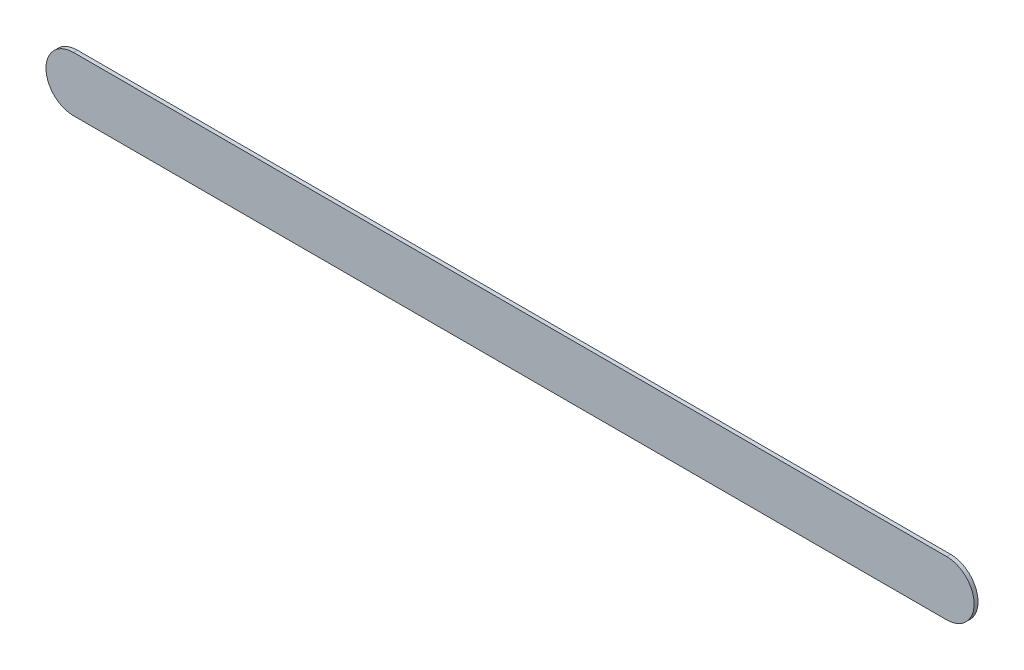
ISO-10303-21;
HEADER;
FILE_DESCRIPTION(('STEP AP214'),'2;1');
FILE_NAME('part.step','',(''),(''),'','','');
FILE_SCHEMA(('AUTOMOTIVE_DESIGN { 1 0 10303 214 1 1 1 1 }'));
ENDSEC;
DATA;
#1=APPLICATION_CONTEXT('core data for automotive mechanical design processes');
#2=APPLICATION_PROTOCOL_DEFINITION('international standard','automotive_design',2000,#1);
#3=PRODUCT_CONTEXT('',#1,'mechanical');
#4=PRODUCT('Part','Part','',(#3));
#5=PRODUCT_RELATED_PRODUCT_CATEGORY('part','',(#4));
#6=PRODUCT_DEFINITION_FORMATION('','',#4);
#7=PRODUCT_DEFINITION_CONTEXT('part definition',#1,'design');
#8=PRODUCT_DEFINITION('design','',#6,#7);
#9=PRODUCT_DEFINITION_SHAPE('','',#8);
#10=(LENGTH_UNIT() NAMED_UNIT(*) SI_UNIT(.MILLI.,.METRE.));
#11=(NAMED_UNIT(*) PLANE_ANGLE_UNIT() SI_UNIT($,.RADIAN.));
#12=(NAMED_UNIT(*) SI_UNIT($,.STERADIAN.) SOLID_ANGLE_UNIT());
#13=UNCERTAINTY_MEASURE_WITH_UNIT(LENGTH_MEASURE(1.E-05),#10,'distance_accuracy_value','');
#14=(GEOMETRIC_REPRESENTATION_CONTEXT(3) GLOBAL_UNCERTAINTY_ASSIGNED_CONTEXT((#13)) GLOBAL_UNIT_ASSIGNED_CONTEXT((#10,
#11,#12)) REPRESENTATION_CONTEXT('',''));
#15=CARTESIAN_POINT('',(0.,0.,0.));
#16=DIRECTION('',(0.,0.,1.));
#17=DIRECTION('',(1.,0.,0.));
#18=AXIS2_PLACEMENT_3D('',#15,#16,#17);
#19=CARTESIAN_POINT('',(41.4020127,100.25201184,0.));
#20=DIRECTION('',(0.,1.,0.));
#21=DIRECTION('',(1.,0.,0.));
#22=AXIS2_PLACEMENT_3D('',#19,#20,#21);
#23=PLANE('',#22);
#24=DIRECTION('',(1.,0.,0.));
#25=VECTOR('',#24,1.);
#26=CARTESIAN_POINT('',(41.4020127,100.25201184,0.03556));
#27=LINE('',#26,#25);
#28=CARTESIAN_POINT('',(41.4020127,100.25201184,0.03556));
#29=VERTEX_POINT('',#28);
#30=CARTESIAN_POINT('',(49.36500414,100.25201184,0.03556));
#31=VERTEX_POINT('',#30);
#32=EDGE_CURVE('E11',#29,#31,#27,.T.);
#33=ORIENTED_EDGE('',*,*,#32,.F.);
#34=DIRECTION('',(0.,0.,1.));
#35=VECTOR('',#34,1.);
#36=CARTESIAN_POINT('',(41.4020127,100.25201184,0.));
#37=LINE('',#36,#35);
#38=CARTESIAN_POINT('',(41.4020127,100.25201184,0.));
#39=VERTEX_POINT('',#38);
#40=EDGE_CURVE('E24',#39,#29,#37,.T.);
#41=ORIENTED_EDGE('',*,*,#40,.F.);
#42=DIRECTION('',(1.,0.,0.));
#43=VECTOR('',#42,1.);
#44=CARTESIAN_POINT('',(41.4020127,100.25201184,0.));
#45=LINE('',#44,#43);
#46=CARTESIAN_POINT('',(49.36500414,100.25201184,0.));
#47=VERTEX_POINT('',#46);
#48=EDGE_CURVE('E75',#39,#47,#45,.T.);
#49=ORIENTED_EDGE('',*,*,#48,.T.);
#50=DIRECTION('',(0.,0.,1.));
#51=VECTOR('',#50,1.);
#52=CARTESIAN_POINT('',(49.36500414,100.25201184,0.));
#53=LINE('',#52,#51);
#54=EDGE_CURVE('E37',#47,#31,#53,.T.);
#55=ORIENTED_EDGE('',*,*,#54,.T.);
#56=EDGE_LOOP('',(#33,#41,#49,#55));
#57=FACE_BOUND('',#56,.T.);
#58=ADVANCED_FACE('F17',(#57),#23,.F.);
#59=CARTESIAN_POINT('',(49.36500414,100.50201134,0.));
#60=DIRECTION('',(0.,0.,-1.));
#61=DIRECTION('',(0.,-1.,0.));
#62=AXIS2_PLACEMENT_3D('',#59,#60,#61);
#63=CYLINDRICAL_SURFACE('',#62,0.249999500000001);
#64=CARTESIAN_POINT('',(49.36500414,100.50201134,0.03556));
#65=DIRECTION('',(0.,0.,1.));
#66=DIRECTION('',(0.,-1.,0.));
#67=AXIS2_PLACEMENT_3D('',#64,#65,#66);
#68=CIRCLE('',#67,0.249999500000001);
#69=CARTESIAN_POINT('',(49.36500414,100.75201084,0.03556));
#70=VERTEX_POINT('',#69);
#71=EDGE_CURVE('E83',#31,#70,#68,.T.);
#72=ORIENTED_EDGE('',*,*,#71,.F.);
#73=ORIENTED_EDGE('',*,*,#54,.F.);
#74=CARTESIAN_POINT('',(49.36500414,100.50201134,0.));
#75=DIRECTION('',(0.,0.,1.));
#76=DIRECTION('',(0.,-1.,0.));
#77=AXIS2_PLACEMENT_3D('',#74,#75,#76);
#78=CIRCLE('',#77,0.249999500000001);
#79=CARTESIAN_POINT('',(49.36500414,100.75201084,0.));
#80=VERTEX_POINT('',#79);
#81=EDGE_CURVE('E81',#47,#80,#78,.T.);
#82=ORIENTED_EDGE('',*,*,#81,.T.);
#83=DIRECTION('',(0.,0.,1.));
#84=VECTOR('',#83,1.);
#85=CARTESIAN_POINT('',(49.36500414,100.75201084,0.));
#86=LINE('',#85,#84);
#87=EDGE_CURVE('E67',#80,#70,#86,.T.);
#88=ORIENTED_EDGE('',*,*,#87,.T.);
#89=EDGE_LOOP('',(#72,#73,#82,#88));
#90=FACE_BOUND('',#89,.T.);
#91=ADVANCED_FACE('F89',(#90),#63,.T.);
#92=CARTESIAN_POINT('',(49.36500414,100.75201084,0.));
#93=DIRECTION('',(0.,-1.,0.));
#94=DIRECTION('',(-1.,0.,0.));
#95=AXIS2_PLACEMENT_3D('',#92,#93,#94);
#96=PLANE('',#95);
#97=DIRECTION('',(-1.,0.,0.));
#98=VECTOR('',#97,1.);
#99=CARTESIAN_POINT('',(49.36500414,100.75201084,0.03556));
#100=LINE('',#99,#98);
#101=CARTESIAN_POINT('',(41.4020127,100.75201084,0.03556));
#102=VERTEX_POINT('',#101);
#103=EDGE_CURVE('E71',#70,#102,#100,.T.);
#104=ORIENTED_EDGE('',*,*,#103,.F.);
#105=ORIENTED_EDGE('',*,*,#87,.F.);
#106=DIRECTION('',(-1.,0.,0.));
#107=VECTOR('',#106,1.);
#108=CARTESIAN_POINT('',(49.36500414,100.75201084,0.));
#109=LINE('',#108,#107);
#110=CARTESIAN_POINT('',(41.4020127,100.75201084,0.));
#111=VERTEX_POINT('',#110);
#112=EDGE_CURVE('E63',#80,#111,#109,.T.);
#113=ORIENTED_EDGE('',*,*,#112,.T.);
#114=DIRECTION('',(0.,0.,1.));
#115=VECTOR('',#114,1.);
#116=CARTESIAN_POINT('',(41.4020127,100.75201084,0.));
#117=LINE('',#116,#115);
#118=EDGE_CURVE('E53',#111,#102,#117,.T.);
#119=ORIENTED_EDGE('',*,*,#118,.T.);
#120=EDGE_LOOP('',(#104,#105,#113,#119));
#121=FACE_BOUND('',#120,.T.);
#122=ADVANCED_FACE('F66',(#121),#96,.F.);
#123=CARTESIAN_POINT('',(41.4020127,100.50201134,0.));
#124=DIRECTION('',(0.,0.,-1.));
#125=DIRECTION('',(0.,1.,0.));
#126=AXIS2_PLACEMENT_3D('',#123,#124,#125);
#127=CYLINDRICAL_SURFACE('',#126,0.249999500000001);
#128=CARTESIAN_POINT('',(41.4020127,100.50201134,0.03556));
#129=DIRECTION('',(0.,0.,1.));
#130=DIRECTION('',(0.,1.,0.));
#131=AXIS2_PLACEMENT_3D('',#128,#129,#130);
#132=CIRCLE('',#131,0.249999500000001);
#133=EDGE_CURVE('E59',#102,#29,#132,.T.);
#134=ORIENTED_EDGE('',*,*,#133,.F.);
#135=ORIENTED_EDGE('',*,*,#118,.F.);
#136=CARTESIAN_POINT('',(41.4020127,100.50201134,0.));
#137=DIRECTION('',(0.,0.,1.));
#138=DIRECTION('',(0.,1.,0.));
#139=AXIS2_PLACEMENT_3D('',#136,#137,#138);
#140=CIRCLE('',#139,0.249999500000001);
#141=EDGE_CURVE('E57',#111,#39,#140,.T.);
#142=ORIENTED_EDGE('',*,*,#141,.T.);
#143=ORIENTED_EDGE('',*,*,#40,.T.);
#144=EDGE_LOOP('',(#134,#135,#142,#143));
#145=FACE_BOUND('',#144,.T.);
#146=ADVANCED_FACE('F55',(#145),#127,.T.);
#147=CARTESIAN_POINT('',(41.4020127,100.25201184,0.));
#148=DIRECTION('',(0.,0.,-1.));
#149=DIRECTION('',(-1.,0.,0.));
#150=AXIS2_PLACEMENT_3D('',#147,#148,#149);
#151=PLANE('',#150);
#152=ORIENTED_EDGE('',*,*,#141,.F.);
#153=ORIENTED_EDGE('',*,*,#112,.F.);
#154=ORIENTED_EDGE('',*,*,#81,.F.);
#155=ORIENTED_EDGE('',*,*,#48,.F.);
#156=EDGE_LOOP('',(#152,#153,#154,#155));
#157=FACE_BOUND('',#156,.T.);
#158=ADVANCED_FACE('F74',(#157),#151,.T.);
#159=CARTESIAN_POINT('',(41.4020127,100.25201184,0.03556));
#160=DIRECTION('',(0.,0.,-1.));
#161=DIRECTION('',(-1.,0.,0.));
#162=AXIS2_PLACEMENT_3D('',#159,#160,#161);
#163=PLANE('',#162);
#164=ORIENTED_EDGE('',*,*,#32,.T.);
#165=ORIENTED_EDGE('',*,*,#71,.T.);
#166=ORIENTED_EDGE('',*,*,#103,.T.);
#167=ORIENTED_EDGE('',*,*,#133,.T.);
#168=EDGE_LOOP('',(#164,#165,#166,#167));
#169=FACE_BOUND('',#168,.T.);
#170=ADVANCED_FACE('F91',(#169),#163,.F.);
#171=CLOSED_SHELL('',(#58,#91,#122,#146,#158,#170));
#172=MANIFOLD_SOLID_BREP('B1',#171);
#173=ADVANCED_BREP_SHAPE_REPRESENTATION('',(#18,#172),#14);
#174=SHAPE_DEFINITION_REPRESENTATION(#9,#173);
ENDSEC;
END-ISO-10303-21;
